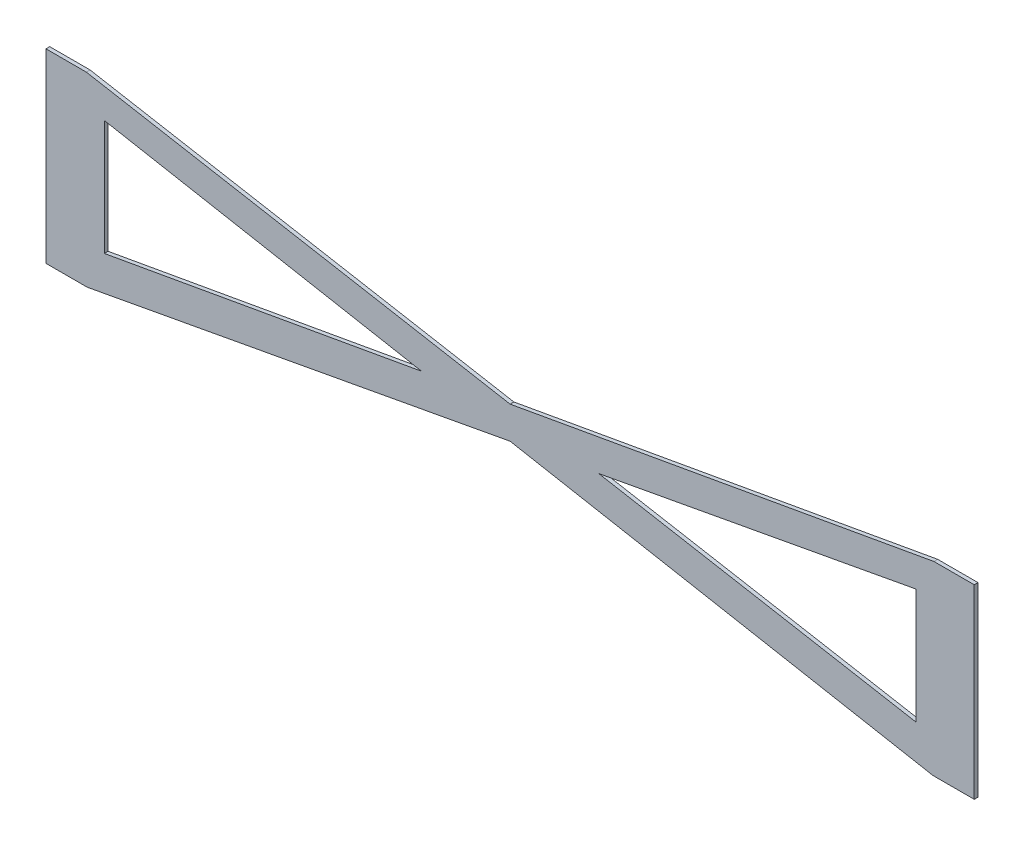
ISO-10303-21;
HEADER;
FILE_DESCRIPTION(('STEP AP214'),'2;1');
FILE_NAME('part.step','',(''),(''),'','','');
FILE_SCHEMA(('AUTOMOTIVE_DESIGN { 1 0 10303 214 1 1 1 1 }'));
ENDSEC;
DATA;
#1=APPLICATION_CONTEXT('core data for automotive mechanical design processes');
#2=APPLICATION_PROTOCOL_DEFINITION('international standard','automotive_design',2000,#1);
#3=PRODUCT_CONTEXT('',#1,'mechanical');
#4=PRODUCT('Part','Part','',(#3));
#5=PRODUCT_RELATED_PRODUCT_CATEGORY('part','',(#4));
#6=PRODUCT_DEFINITION_FORMATION('','',#4);
#7=PRODUCT_DEFINITION_CONTEXT('part definition',#1,'design');
#8=PRODUCT_DEFINITION('design','',#6,#7);
#9=PRODUCT_DEFINITION_SHAPE('','',#8);
#10=(LENGTH_UNIT() NAMED_UNIT(*) SI_UNIT(.MILLI.,.METRE.));
#11=(NAMED_UNIT(*) PLANE_ANGLE_UNIT() SI_UNIT($,.RADIAN.));
#12=(NAMED_UNIT(*) SI_UNIT($,.STERADIAN.) SOLID_ANGLE_UNIT());
#13=UNCERTAINTY_MEASURE_WITH_UNIT(LENGTH_MEASURE(1.E-05),#10,'distance_accuracy_value','');
#14=(GEOMETRIC_REPRESENTATION_CONTEXT(3) GLOBAL_UNCERTAINTY_ASSIGNED_CONTEXT((#13)) GLOBAL_UNIT_ASSIGNED_CONTEXT((#10,
#11,#12)) REPRESENTATION_CONTEXT('',''));
#15=CARTESIAN_POINT('',(0.,0.,0.));
#16=DIRECTION('',(0.,0.,1.));
#17=DIRECTION('',(1.,0.,0.));
#18=AXIS2_PLACEMENT_3D('',#15,#16,#17);
#19=CARTESIAN_POINT('',(0.,0.,1.));
#20=DIRECTION('',(0.,0.,-1.));
#21=DIRECTION('',(-1.,0.,0.));
#22=AXIS2_PLACEMENT_3D('',#19,#20,#21);
#23=PLANE('',#22);
#24=DIRECTION('',(0.984447907206048,0.175676742904779,0.));
#25=VECTOR('',#24,1.);
#26=CARTESIAN_POINT('',(99.9298920153493,25.1202753574179,1.));
#27=LINE('',#26,#25);
#28=CARTESIAN_POINT('',(15.5,10.0535884108689,1.));
#29=VERTEX_POINT('',#28);
#30=CARTESIAN_POINT('',(99.9298920153493,25.1202753574179,1.));
#31=VERTEX_POINT('',#30);
#32=EDGE_CURVE('E173',#29,#31,#27,.T.);
#33=ORIENTED_EDGE('',*,*,#32,.F.);
#34=DIRECTION('',(0.,-1.,0.));
#35=VECTOR('',#34,1.);
#36=CARTESIAN_POINT('',(15.5,10.0535884108689,1.));
#37=LINE('',#36,#35);
#38=CARTESIAN_POINT('',(15.5,40.7056712671806,1.));
#39=VERTEX_POINT('',#38);
#40=EDGE_CURVE('E179',#39,#29,#37,.T.);
#41=ORIENTED_EDGE('',*,*,#40,.F.);
#42=DIRECTION('',(-0.98338563427124,0.181528769920777,0.));
#43=VECTOR('',#42,1.);
#44=CARTESIAN_POINT('',(15.5,40.7056712671806,1.));
#45=LINE('',#44,#43);
#46=EDGE_CURVE('E175',#31,#39,#45,.T.);
#47=ORIENTED_EDGE('',*,*,#46,.F.);
#48=EDGE_LOOP('',(#33,#41,#47));
#49=FACE_BOUND('',#48,.T.);
#50=DIRECTION('',(0.,-1.,0.));
#51=VECTOR('',#50,1.);
#52=CARTESIAN_POINT('',(0.,0.,1.));
#53=LINE('',#52,#51);
#54=CARTESIAN_POINT('',(0.,49.45,1.));
#55=VERTEX_POINT('',#54);
#56=CARTESIAN_POINT('',(0.,0.,1.));
#57=VERTEX_POINT('',#56);
#58=EDGE_CURVE('E197',#55,#57,#53,.T.);
#59=ORIENTED_EDGE('',*,*,#58,.T.);
#60=DIRECTION('',(1.,0.,0.));
#61=VECTOR('',#60,1.);
#62=CARTESIAN_POINT('',(0.,0.,1.));
#63=LINE('',#62,#61);
#64=CARTESIAN_POINT('',(10.9854067749023,0.,1.));
#65=VERTEX_POINT('',#64);
#66=EDGE_CURVE('E200',#57,#65,#63,.T.);
#67=ORIENTED_EDGE('',*,*,#66,.T.);
#68=DIRECTION('',(0.98338563427124,0.181528769920777,0.));
#69=VECTOR('',#68,1.);
#70=CARTESIAN_POINT('',(123.4989795,20.7695229057467,1.));
#71=LINE('',#70,#69);
#72=CARTESIAN_POINT('',(123.4989795,20.7695229057467,1.));
#73=VERTEX_POINT('',#72);
#74=EDGE_CURVE('E203',#65,#73,#71,.T.);
#75=ORIENTED_EDGE('',*,*,#74,.T.);
#76=DIRECTION('',(0.98338563427124,-0.181528769920776,0.));
#77=VECTOR('',#76,1.);
#78=CARTESIAN_POINT('',(123.4989795,20.7695229057467,1.));
#79=LINE('',#78,#77);
#80=CARTESIAN_POINT('',(236.012552225098,0.,1.));
#81=VERTEX_POINT('',#80);
#82=EDGE_CURVE('E205',#73,#81,#79,.T.);
#83=ORIENTED_EDGE('',*,*,#82,.T.);
#84=DIRECTION('',(1.,0.,0.));
#85=VECTOR('',#84,1.);
#86=CARTESIAN_POINT('',(236.012552225098,0.,1.));
#87=LINE('',#86,#85);
#88=CARTESIAN_POINT('',(246.997959,0.,1.));
#89=VERTEX_POINT('',#88);
#90=EDGE_CURVE('E207',#81,#89,#87,.T.);
#91=ORIENTED_EDGE('',*,*,#90,.T.);
#92=DIRECTION('',(0.,1.,0.));
#93=VECTOR('',#92,1.);
#94=CARTESIAN_POINT('',(246.997959,0.,1.));
#95=LINE('',#94,#93);
#96=CARTESIAN_POINT('',(246.997959,49.45,1.));
#97=VERTEX_POINT('',#96);
#98=EDGE_CURVE('E209',#89,#97,#95,.T.);
#99=ORIENTED_EDGE('',*,*,#98,.T.);
#100=DIRECTION('',(-1.,0.,0.));
#101=VECTOR('',#100,1.);
#102=CARTESIAN_POINT('',(236.267497729452,49.45,1.));
#103=LINE('',#102,#101);
#104=CARTESIAN_POINT('',(236.267497729452,49.45,1.));
#105=VERTEX_POINT('',#104);
#106=EDGE_CURVE('E211',#97,#105,#103,.T.);
#107=ORIENTED_EDGE('',*,*,#106,.T.);
#108=DIRECTION('',(-0.984447907206048,-0.175676742904779,0.));
#109=VECTOR('',#108,1.);
#110=CARTESIAN_POINT('',(236.267497729452,49.45,1.));
#111=LINE('',#110,#109);
#112=CARTESIAN_POINT('',(123.4989795,29.3262272338279,1.));
#113=VERTEX_POINT('',#112);
#114=EDGE_CURVE('E213',#105,#113,#111,.T.);
#115=ORIENTED_EDGE('',*,*,#114,.T.);
#116=DIRECTION('',(-0.984447907206048,0.175676742904778,0.));
#117=VECTOR('',#116,1.);
#118=CARTESIAN_POINT('',(10.7304612705484,49.45,1.));
#119=LINE('',#118,#117);
#120=CARTESIAN_POINT('',(10.7304612705484,49.45,1.));
#121=VERTEX_POINT('',#120);
#122=EDGE_CURVE('E215',#113,#121,#119,.T.);
#123=ORIENTED_EDGE('',*,*,#122,.T.);
#124=DIRECTION('',(-1.,0.,0.));
#125=VECTOR('',#124,1.);
#126=CARTESIAN_POINT('',(0.,49.45,1.));
#127=LINE('',#126,#125);
#128=EDGE_CURVE('E217',#121,#55,#127,.T.);
#129=ORIENTED_EDGE('',*,*,#128,.T.);
#130=EDGE_LOOP('',(#59,#67,#75,#83,#91,#99,#107,#115,#123,#129));
#131=FACE_BOUND('',#130,.T.);
#132=DIRECTION('',(0.984447907206048,-0.175676742904778,0.));
#133=VECTOR('',#132,1.);
#134=CARTESIAN_POINT('',(147.06806698465,25.1202753574179,1.));
#135=LINE('',#134,#133);
#136=CARTESIAN_POINT('',(147.06806698465,25.1202753574179,1.));
#137=VERTEX_POINT('',#136);
#138=CARTESIAN_POINT('',(231.497959,10.0535884108689,1.));
#139=VERTEX_POINT('',#138);
#140=EDGE_CURVE('E146',#137,#139,#135,.T.);
#141=ORIENTED_EDGE('',*,*,#140,.F.);
#142=DIRECTION('',(-0.983385634271241,-0.181528769920776,0.));
#143=VECTOR('',#142,1.);
#144=CARTESIAN_POINT('',(231.497959,40.7056712671806,1.));
#145=LINE('',#144,#143);
#146=CARTESIAN_POINT('',(231.497959,40.7056712671806,1.));
#147=VERTEX_POINT('',#146);
#148=EDGE_CURVE('E163',#147,#137,#145,.T.);
#149=ORIENTED_EDGE('',*,*,#148,.F.);
#150=DIRECTION('',(0.,1.,0.));
#151=VECTOR('',#150,1.);
#152=CARTESIAN_POINT('',(231.497959,10.0535884108689,1.));
#153=LINE('',#152,#151);
#154=EDGE_CURVE('E154',#139,#147,#153,.T.);
#155=ORIENTED_EDGE('',*,*,#154,.F.);
#156=EDGE_LOOP('',(#141,#149,#155));
#157=FACE_BOUND('',#156,.T.);
#158=ADVANCED_FACE('F33',(#49,#131,#157),#23,.F.);
#159=CARTESIAN_POINT('',(0.,0.,0.));
#160=DIRECTION('',(0.,0.,-1.));
#161=DIRECTION('',(-1.,0.,0.));
#162=AXIS2_PLACEMENT_3D('',#159,#160,#161);
#163=PLANE('',#162);
#164=DIRECTION('',(0.,-1.,0.));
#165=VECTOR('',#164,1.);
#166=CARTESIAN_POINT('',(0.,0.,0.));
#167=LINE('',#166,#165);
#168=CARTESIAN_POINT('',(0.,49.45,0.));
#169=VERTEX_POINT('',#168);
#170=CARTESIAN_POINT('',(0.,0.,0.));
#171=VERTEX_POINT('',#170);
#172=EDGE_CURVE('E196',#169,#171,#167,.T.);
#173=ORIENTED_EDGE('',*,*,#172,.F.);
#174=DIRECTION('',(-1.,0.,0.));
#175=VECTOR('',#174,1.);
#176=CARTESIAN_POINT('',(0.,49.45,0.));
#177=LINE('',#176,#175);
#178=CARTESIAN_POINT('',(10.7304612705484,49.45,0.));
#179=VERTEX_POINT('',#178);
#180=EDGE_CURVE('E201',#179,#169,#177,.T.);
#181=ORIENTED_EDGE('',*,*,#180,.F.);
#182=DIRECTION('',(-0.984447907206048,0.175676742904778,0.));
#183=VECTOR('',#182,1.);
#184=CARTESIAN_POINT('',(10.7304612705484,49.45,0.));
#185=LINE('',#184,#183);
#186=CARTESIAN_POINT('',(123.4989795,29.3262272338279,0.));
#187=VERTEX_POINT('',#186);
#188=EDGE_CURVE('E236',#187,#179,#185,.T.);
#189=ORIENTED_EDGE('',*,*,#188,.F.);
#190=DIRECTION('',(-0.984447907206048,-0.175676742904779,0.));
#191=VECTOR('',#190,1.);
#192=CARTESIAN_POINT('',(236.267497729452,49.45,0.));
#193=LINE('',#192,#191);
#194=CARTESIAN_POINT('',(236.267497729452,49.45,0.));
#195=VERTEX_POINT('',#194);
#196=EDGE_CURVE('E234',#195,#187,#193,.T.);
#197=ORIENTED_EDGE('',*,*,#196,.F.);
#198=DIRECTION('',(-1.,0.,0.));
#199=VECTOR('',#198,1.);
#200=CARTESIAN_POINT('',(236.267497729452,49.45,0.));
#201=LINE('',#200,#199);
#202=CARTESIAN_POINT('',(246.997959,49.45,0.));
#203=VERTEX_POINT('',#202);
#204=EDGE_CURVE('E232',#203,#195,#201,.T.);
#205=ORIENTED_EDGE('',*,*,#204,.F.);
#206=DIRECTION('',(0.,1.,0.));
#207=VECTOR('',#206,1.);
#208=CARTESIAN_POINT('',(246.997959,0.,0.));
#209=LINE('',#208,#207);
#210=CARTESIAN_POINT('',(246.997959,0.,0.));
#211=VERTEX_POINT('',#210);
#212=EDGE_CURVE('E230',#211,#203,#209,.T.);
#213=ORIENTED_EDGE('',*,*,#212,.F.);
#214=DIRECTION('',(1.,0.,0.));
#215=VECTOR('',#214,1.);
#216=CARTESIAN_POINT('',(236.012552225098,0.,0.));
#217=LINE('',#216,#215);
#218=CARTESIAN_POINT('',(236.012552225098,0.,0.));
#219=VERTEX_POINT('',#218);
#220=EDGE_CURVE('E228',#219,#211,#217,.T.);
#221=ORIENTED_EDGE('',*,*,#220,.F.);
#222=DIRECTION('',(0.98338563427124,-0.181528769920776,0.));
#223=VECTOR('',#222,1.);
#224=CARTESIAN_POINT('',(123.4989795,20.7695229057467,0.));
#225=LINE('',#224,#223);
#226=CARTESIAN_POINT('',(123.4989795,20.7695229057467,0.));
#227=VERTEX_POINT('',#226);
#228=EDGE_CURVE('E226',#227,#219,#225,.T.);
#229=ORIENTED_EDGE('',*,*,#228,.F.);
#230=DIRECTION('',(0.98338563427124,0.181528769920777,0.));
#231=VECTOR('',#230,1.);
#232=CARTESIAN_POINT('',(123.4989795,20.7695229057467,0.));
#233=LINE('',#232,#231);
#234=CARTESIAN_POINT('',(10.9854067749023,0.,0.));
#235=VERTEX_POINT('',#234);
#236=EDGE_CURVE('E224',#235,#227,#233,.T.);
#237=ORIENTED_EDGE('',*,*,#236,.F.);
#238=DIRECTION('',(1.,0.,0.));
#239=VECTOR('',#238,1.);
#240=CARTESIAN_POINT('',(0.,0.,0.));
#241=LINE('',#240,#239);
#242=EDGE_CURVE('E222',#171,#235,#241,.T.);
#243=ORIENTED_EDGE('',*,*,#242,.F.);
#244=EDGE_LOOP('',(#173,#181,#189,#197,#205,#213,#221,#229,#237,#243));
#245=FACE_BOUND('',#244,.T.);
#246=DIRECTION('',(0.,-1.,0.));
#247=VECTOR('',#246,1.);
#248=CARTESIAN_POINT('',(15.5,10.0535884108689,0.));
#249=LINE('',#248,#247);
#250=CARTESIAN_POINT('',(15.5,40.7056712671806,0.));
#251=VERTEX_POINT('',#250);
#252=CARTESIAN_POINT('',(15.5,10.0535884108689,0.));
#253=VERTEX_POINT('',#252);
#254=EDGE_CURVE('E176',#251,#253,#249,.T.);
#255=ORIENTED_EDGE('',*,*,#254,.T.);
#256=DIRECTION('',(0.984447907206048,0.175676742904779,0.));
#257=VECTOR('',#256,1.);
#258=CARTESIAN_POINT('',(99.9298920153493,25.1202753574179,0.));
#259=LINE('',#258,#257);
#260=CARTESIAN_POINT('',(99.9298920153493,25.1202753574179,0.));
#261=VERTEX_POINT('',#260);
#262=EDGE_CURVE('E161',#253,#261,#259,.T.);
#263=ORIENTED_EDGE('',*,*,#262,.T.);
#264=DIRECTION('',(-0.98338563427124,0.181528769920777,0.));
#265=VECTOR('',#264,1.);
#266=CARTESIAN_POINT('',(15.5,40.7056712671806,0.));
#267=LINE('',#266,#265);
#268=EDGE_CURVE('E184',#261,#251,#267,.T.);
#269=ORIENTED_EDGE('',*,*,#268,.T.);
#270=EDGE_LOOP('',(#255,#263,#269));
#271=FACE_BOUND('',#270,.T.);
#272=DIRECTION('',(-0.983385634271241,-0.181528769920776,0.));
#273=VECTOR('',#272,1.);
#274=CARTESIAN_POINT('',(231.497959,40.7056712671806,0.));
#275=LINE('',#274,#273);
#276=CARTESIAN_POINT('',(231.497959,40.7056712671806,0.));
#277=VERTEX_POINT('',#276);
#278=CARTESIAN_POINT('',(147.06806698465,25.1202753574179,0.));
#279=VERTEX_POINT('',#278);
#280=EDGE_CURVE('E155',#277,#279,#275,.T.);
#281=ORIENTED_EDGE('',*,*,#280,.T.);
#282=DIRECTION('',(0.984447907206048,-0.175676742904778,0.));
#283=VECTOR('',#282,1.);
#284=CARTESIAN_POINT('',(147.06806698465,25.1202753574179,0.));
#285=LINE('',#284,#283);
#286=CARTESIAN_POINT('',(231.497959,10.0535884108689,0.));
#287=VERTEX_POINT('',#286);
#288=EDGE_CURVE('E56',#279,#287,#285,.T.);
#289=ORIENTED_EDGE('',*,*,#288,.T.);
#290=DIRECTION('',(0.,1.,0.));
#291=VECTOR('',#290,1.);
#292=CARTESIAN_POINT('',(231.497959,10.0535884108689,0.));
#293=LINE('',#292,#291);
#294=EDGE_CURVE('E160',#287,#277,#293,.T.);
#295=ORIENTED_EDGE('',*,*,#294,.T.);
#296=EDGE_LOOP('',(#281,#289,#295));
#297=FACE_BOUND('',#296,.T.);
#298=ADVANCED_FACE('F272',(#245,#271,#297),#163,.T.);
#299=CARTESIAN_POINT('',(0.,0.,1.));
#300=DIRECTION('',(1.,0.,0.));
#301=DIRECTION('',(0.,0.,-1.));
#302=AXIS2_PLACEMENT_3D('',#299,#300,#301);
#303=PLANE('',#302);
#304=ORIENTED_EDGE('',*,*,#172,.T.);
#305=DIRECTION('',(0.,0.,-1.));
#306=VECTOR('',#305,1.);
#307=CARTESIAN_POINT('',(0.,0.,1.));
#308=LINE('',#307,#306);
#309=EDGE_CURVE('E11',#57,#171,#308,.T.);
#310=ORIENTED_EDGE('',*,*,#309,.F.);
#311=ORIENTED_EDGE('',*,*,#58,.F.);
#312=DIRECTION('',(0.,0.,-1.));
#313=VECTOR('',#312,1.);
#314=CARTESIAN_POINT('',(0.,49.45,1.));
#315=LINE('',#314,#313);
#316=EDGE_CURVE('E219',#55,#169,#315,.T.);
#317=ORIENTED_EDGE('',*,*,#316,.T.);
#318=EDGE_LOOP('',(#304,#310,#311,#317));
#319=FACE_BOUND('',#318,.T.);
#320=ADVANCED_FACE('F35',(#319),#303,.F.);
#321=CARTESIAN_POINT('',(0.,0.,1.));
#322=DIRECTION('',(0.,1.,0.));
#323=DIRECTION('',(0.,0.,1.));
#324=AXIS2_PLACEMENT_3D('',#321,#322,#323);
#325=PLANE('',#324);
#326=ORIENTED_EDGE('',*,*,#242,.T.);
#327=DIRECTION('',(0.,0.,-1.));
#328=VECTOR('',#327,1.);
#329=CARTESIAN_POINT('',(10.9854067749023,0.,1.));
#330=LINE('',#329,#328);
#331=EDGE_CURVE('E41',#65,#235,#330,.T.);
#332=ORIENTED_EDGE('',*,*,#331,.F.);
#333=ORIENTED_EDGE('',*,*,#66,.F.);
#334=ORIENTED_EDGE('',*,*,#309,.T.);
#335=EDGE_LOOP('',(#326,#332,#333,#334));
#336=FACE_BOUND('',#335,.T.);
#337=ADVANCED_FACE('F289',(#336),#325,.F.);
#338=CARTESIAN_POINT('',(123.4989795,20.7695229057467,1.));
#339=DIRECTION('',(-0.181528769920777,0.98338563427124,0.));
#340=DIRECTION('',(-0.98338563427124,-0.181528769920777,0.));
#341=AXIS2_PLACEMENT_3D('',#338,#339,#340);
#342=PLANE('',#341);
#343=ORIENTED_EDGE('',*,*,#236,.T.);
#344=DIRECTION('',(0.,0.,-1.));
#345=VECTOR('',#344,1.);
#346=CARTESIAN_POINT('',(123.4989795,20.7695229057467,1.));
#347=LINE('',#346,#345);
#348=EDGE_CURVE('E259',#73,#227,#347,.T.);
#349=ORIENTED_EDGE('',*,*,#348,.F.);
#350=ORIENTED_EDGE('',*,*,#74,.F.);
#351=ORIENTED_EDGE('',*,*,#331,.T.);
#352=EDGE_LOOP('',(#343,#349,#350,#351));
#353=FACE_BOUND('',#352,.T.);
#354=ADVANCED_FACE('F266',(#353),#342,.F.);
#355=CARTESIAN_POINT('',(123.4989795,20.7695229057467,1.));
#356=DIRECTION('',(0.181528769920776,0.98338563427124,0.));
#357=DIRECTION('',(-0.983385634271241,0.181528769920776,0.));
#358=AXIS2_PLACEMENT_3D('',#355,#356,#357);
#359=PLANE('',#358);
#360=ORIENTED_EDGE('',*,*,#228,.T.);
#361=DIRECTION('',(0.,0.,-1.));
#362=VECTOR('',#361,1.);
#363=CARTESIAN_POINT('',(236.012552225098,0.,1.));
#364=LINE('',#363,#362);
#365=EDGE_CURVE('E256',#81,#219,#364,.T.);
#366=ORIENTED_EDGE('',*,*,#365,.F.);
#367=ORIENTED_EDGE('',*,*,#82,.F.);
#368=ORIENTED_EDGE('',*,*,#348,.T.);
#369=EDGE_LOOP('',(#360,#366,#367,#368));
#370=FACE_BOUND('',#369,.T.);
#371=ADVANCED_FACE('F278',(#370),#359,.F.);
#372=CARTESIAN_POINT('',(236.012552225098,0.,1.));
#373=DIRECTION('',(0.,1.,0.));
#374=DIRECTION('',(0.,0.,1.));
#375=AXIS2_PLACEMENT_3D('',#372,#373,#374);
#376=PLANE('',#375);
#377=ORIENTED_EDGE('',*,*,#220,.T.);
#378=DIRECTION('',(0.,0.,-1.));
#379=VECTOR('',#378,1.);
#380=CARTESIAN_POINT('',(246.997959,0.,1.));
#381=LINE('',#380,#379);
#382=EDGE_CURVE('E253',#89,#211,#381,.T.);
#383=ORIENTED_EDGE('',*,*,#382,.F.);
#384=ORIENTED_EDGE('',*,*,#90,.F.);
#385=ORIENTED_EDGE('',*,*,#365,.T.);
#386=EDGE_LOOP('',(#377,#383,#384,#385));
#387=FACE_BOUND('',#386,.T.);
#388=ADVANCED_FACE('F282',(#387),#376,.F.);
#389=CARTESIAN_POINT('',(246.997959,0.,1.));
#390=DIRECTION('',(-1.,0.,0.));
#391=DIRECTION('',(0.,0.,1.));
#392=AXIS2_PLACEMENT_3D('',#389,#390,#391);
#393=PLANE('',#392);
#394=ORIENTED_EDGE('',*,*,#212,.T.);
#395=DIRECTION('',(0.,0.,-1.));
#396=VECTOR('',#395,1.);
#397=CARTESIAN_POINT('',(246.997959,49.45,1.));
#398=LINE('',#397,#396);
#399=EDGE_CURVE('E250',#97,#203,#398,.T.);
#400=ORIENTED_EDGE('',*,*,#399,.F.);
#401=ORIENTED_EDGE('',*,*,#98,.F.);
#402=ORIENTED_EDGE('',*,*,#382,.T.);
#403=EDGE_LOOP('',(#394,#400,#401,#402));
#404=FACE_BOUND('',#403,.T.);
#405=ADVANCED_FACE('F312',(#404),#393,.F.);
#406=CARTESIAN_POINT('',(236.267497729452,49.45,1.));
#407=DIRECTION('',(0.,-1.,0.));
#408=DIRECTION('',(0.,0.,-1.));
#409=AXIS2_PLACEMENT_3D('',#406,#407,#408);
#410=PLANE('',#409);
#411=ORIENTED_EDGE('',*,*,#204,.T.);
#412=DIRECTION('',(0.,0.,-1.));
#413=VECTOR('',#412,1.);
#414=CARTESIAN_POINT('',(236.267497729452,49.45,1.));
#415=LINE('',#414,#413);
#416=EDGE_CURVE('E247',#105,#195,#415,.T.);
#417=ORIENTED_EDGE('',*,*,#416,.F.);
#418=ORIENTED_EDGE('',*,*,#106,.F.);
#419=ORIENTED_EDGE('',*,*,#399,.T.);
#420=EDGE_LOOP('',(#411,#417,#418,#419));
#421=FACE_BOUND('',#420,.T.);
#422=ADVANCED_FACE('F309',(#421),#410,.F.);
#423=CARTESIAN_POINT('',(236.267497729452,49.45,1.));
#424=DIRECTION('',(0.175676742904779,-0.984447907206048,0.));
#425=DIRECTION('',(0.984447907206048,0.175676742904779,0.));
#426=AXIS2_PLACEMENT_3D('',#423,#424,#425);
#427=PLANE('',#426);
#428=ORIENTED_EDGE('',*,*,#196,.T.);
#429=DIRECTION('',(0.,0.,-1.));
#430=VECTOR('',#429,1.);
#431=CARTESIAN_POINT('',(123.4989795,29.3262272338279,1.));
#432=LINE('',#431,#430);
#433=EDGE_CURVE('E244',#113,#187,#432,.T.);
#434=ORIENTED_EDGE('',*,*,#433,.F.);
#435=ORIENTED_EDGE('',*,*,#114,.F.);
#436=ORIENTED_EDGE('',*,*,#416,.T.);
#437=EDGE_LOOP('',(#428,#434,#435,#436));
#438=FACE_BOUND('',#437,.T.);
#439=ADVANCED_FACE('F305',(#438),#427,.F.);
#440=CARTESIAN_POINT('',(10.7304612705484,49.45,1.));
#441=DIRECTION('',(-0.175676742904778,-0.984447907206048,0.));
#442=DIRECTION('',(0.984447907206049,-0.175676742904778,0.));
#443=AXIS2_PLACEMENT_3D('',#440,#441,#442);
#444=PLANE('',#443);
#445=ORIENTED_EDGE('',*,*,#188,.T.);
#446=DIRECTION('',(0.,0.,-1.));
#447=VECTOR('',#446,1.);
#448=CARTESIAN_POINT('',(10.7304612705484,49.45,1.));
#449=LINE('',#448,#447);
#450=EDGE_CURVE('E241',#121,#179,#449,.T.);
#451=ORIENTED_EDGE('',*,*,#450,.F.);
#452=ORIENTED_EDGE('',*,*,#122,.F.);
#453=ORIENTED_EDGE('',*,*,#433,.T.);
#454=EDGE_LOOP('',(#445,#451,#452,#453));
#455=FACE_BOUND('',#454,.T.);
#456=ADVANCED_FACE('F301',(#455),#444,.F.);
#457=CARTESIAN_POINT('',(0.,49.45,1.));
#458=DIRECTION('',(0.,-1.,0.));
#459=DIRECTION('',(0.,0.,-1.));
#460=AXIS2_PLACEMENT_3D('',#457,#458,#459);
#461=PLANE('',#460);
#462=ORIENTED_EDGE('',*,*,#180,.T.);
#463=ORIENTED_EDGE('',*,*,#316,.F.);
#464=ORIENTED_EDGE('',*,*,#128,.F.);
#465=ORIENTED_EDGE('',*,*,#450,.T.);
#466=EDGE_LOOP('',(#462,#463,#464,#465));
#467=FACE_BOUND('',#466,.T.);
#468=ADVANCED_FACE('F296',(#467),#461,.F.);
#469=CARTESIAN_POINT('',(99.9298920153493,25.1202753574179,1.));
#470=DIRECTION('',(-0.175676742904779,0.984447907206048,0.));
#471=DIRECTION('',(-0.984447907206048,-0.175676742904779,0.));
#472=AXIS2_PLACEMENT_3D('',#469,#470,#471);
#473=PLANE('',#472);
#474=ORIENTED_EDGE('',*,*,#262,.F.);
#475=DIRECTION('',(0.,0.,-1.));
#476=VECTOR('',#475,1.);
#477=CARTESIAN_POINT('',(15.5,10.0535884108689,1.));
#478=LINE('',#477,#476);
#479=EDGE_CURVE('E181',#29,#253,#478,.T.);
#480=ORIENTED_EDGE('',*,*,#479,.F.);
#481=ORIENTED_EDGE('',*,*,#32,.T.);
#482=DIRECTION('',(0.,0.,-1.));
#483=VECTOR('',#482,1.);
#484=CARTESIAN_POINT('',(99.9298920153493,25.1202753574179,1.));
#485=LINE('',#484,#483);
#486=EDGE_CURVE('E193',#31,#261,#485,.T.);
#487=ORIENTED_EDGE('',*,*,#486,.T.);
#488=EDGE_LOOP('',(#474,#480,#481,#487));
#489=FACE_BOUND('',#488,.T.);
#490=ADVANCED_FACE('F330',(#489),#473,.T.);
#491=CARTESIAN_POINT('',(15.5,40.7056712671806,1.));
#492=DIRECTION('',(-0.181528769920777,-0.98338563427124,0.));
#493=DIRECTION('',(0.98338563427124,-0.181528769920777,0.));
#494=AXIS2_PLACEMENT_3D('',#491,#492,#493);
#495=PLANE('',#494);
#496=ORIENTED_EDGE('',*,*,#268,.F.);
#497=ORIENTED_EDGE('',*,*,#486,.F.);
#498=ORIENTED_EDGE('',*,*,#46,.T.);
#499=DIRECTION('',(0.,0.,-1.));
#500=VECTOR('',#499,1.);
#501=CARTESIAN_POINT('',(15.5,40.7056712671806,1.));
#502=LINE('',#501,#500);
#503=EDGE_CURVE('E191',#39,#251,#502,.T.);
#504=ORIENTED_EDGE('',*,*,#503,.T.);
#505=EDGE_LOOP('',(#496,#497,#498,#504));
#506=FACE_BOUND('',#505,.T.);
#507=ADVANCED_FACE('F356',(#506),#495,.T.);
#508=CARTESIAN_POINT('',(15.5,10.0535884108689,1.));
#509=DIRECTION('',(1.,0.,0.));
#510=DIRECTION('',(0.,1.,0.));
#511=AXIS2_PLACEMENT_3D('',#508,#509,#510);
#512=PLANE('',#511);
#513=ORIENTED_EDGE('',*,*,#254,.F.);
#514=ORIENTED_EDGE('',*,*,#503,.F.);
#515=ORIENTED_EDGE('',*,*,#40,.T.);
#516=ORIENTED_EDGE('',*,*,#479,.T.);
#517=EDGE_LOOP('',(#513,#514,#515,#516));
#518=FACE_BOUND('',#517,.T.);
#519=ADVANCED_FACE('F363',(#518),#512,.T.);
#520=CARTESIAN_POINT('',(147.06806698465,25.1202753574179,1.));
#521=DIRECTION('',(0.175676742904778,0.984447907206048,0.));
#522=DIRECTION('',(-0.984447907206049,0.175676742904778,0.));
#523=AXIS2_PLACEMENT_3D('',#520,#521,#522);
#524=PLANE('',#523);
#525=ORIENTED_EDGE('',*,*,#288,.F.);
#526=DIRECTION('',(0.,0.,-1.));
#527=VECTOR('',#526,1.);
#528=CARTESIAN_POINT('',(147.06806698465,25.1202753574179,1.));
#529=LINE('',#528,#527);
#530=EDGE_CURVE('E150',#137,#279,#529,.T.);
#531=ORIENTED_EDGE('',*,*,#530,.F.);
#532=ORIENTED_EDGE('',*,*,#140,.T.);
#533=DIRECTION('',(0.,0.,-1.));
#534=VECTOR('',#533,1.);
#535=CARTESIAN_POINT('',(231.497959,10.0535884108689,1.));
#536=LINE('',#535,#534);
#537=EDGE_CURVE('E149',#139,#287,#536,.T.);
#538=ORIENTED_EDGE('',*,*,#537,.T.);
#539=EDGE_LOOP('',(#525,#531,#532,#538));
#540=FACE_BOUND('',#539,.T.);
#541=ADVANCED_FACE('F148',(#540),#524,.T.);
#542=CARTESIAN_POINT('',(231.497959,10.0535884108689,1.));
#543=DIRECTION('',(-1.,0.,0.));
#544=DIRECTION('',(0.,-1.,0.));
#545=AXIS2_PLACEMENT_3D('',#542,#543,#544);
#546=PLANE('',#545);
#547=ORIENTED_EDGE('',*,*,#294,.F.);
#548=ORIENTED_EDGE('',*,*,#537,.F.);
#549=ORIENTED_EDGE('',*,*,#154,.T.);
#550=DIRECTION('',(0.,0.,-1.));
#551=VECTOR('',#550,1.);
#552=CARTESIAN_POINT('',(231.497959,40.7056712671806,1.));
#553=LINE('',#552,#551);
#554=EDGE_CURVE('E48',#147,#277,#553,.T.);
#555=ORIENTED_EDGE('',*,*,#554,.T.);
#556=EDGE_LOOP('',(#547,#548,#549,#555));
#557=FACE_BOUND('',#556,.T.);
#558=ADVANCED_FACE('F158',(#557),#546,.T.);
#559=CARTESIAN_POINT('',(231.497959,40.7056712671806,1.));
#560=DIRECTION('',(0.181528769920776,-0.983385634271241,0.));
#561=DIRECTION('',(0.983385634271241,0.181528769920776,0.));
#562=AXIS2_PLACEMENT_3D('',#559,#560,#561);
#563=PLANE('',#562);
#564=ORIENTED_EDGE('',*,*,#280,.F.);
#565=ORIENTED_EDGE('',*,*,#554,.F.);
#566=ORIENTED_EDGE('',*,*,#148,.T.);
#567=ORIENTED_EDGE('',*,*,#530,.T.);
#568=EDGE_LOOP('',(#564,#565,#566,#567));
#569=FACE_BOUND('',#568,.T.);
#570=ADVANCED_FACE('F383',(#569),#563,.T.);
#571=CLOSED_SHELL('',(#158,#298,#320,#337,#354,#371,#388,#405,#422,#439,#456,#468,#490,#507,
#519,#541,#558,#570));
#572=MANIFOLD_SOLID_BREP('B2',#571);
#573=ADVANCED_BREP_SHAPE_REPRESENTATION('',(#18,#572),#14);
#574=SHAPE_DEFINITION_REPRESENTATION(#9,#573);
ENDSEC;
END-ISO-10303-21;
